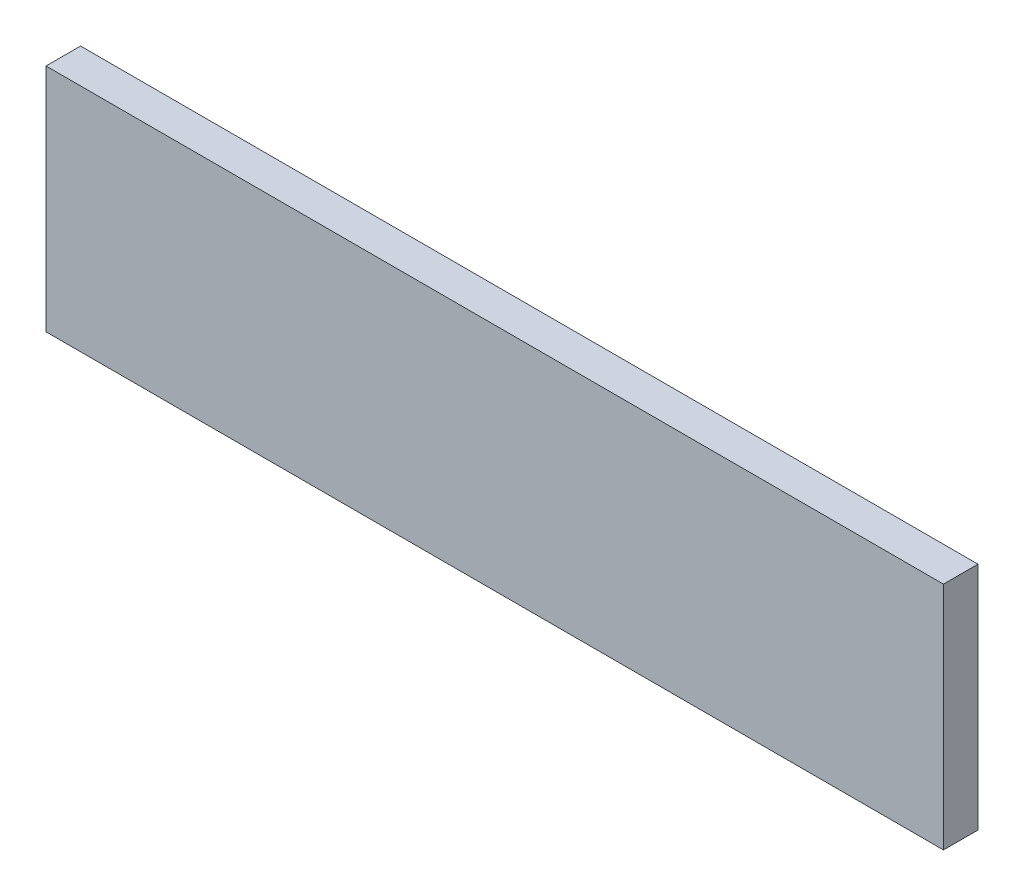
ISO-10303-21;
HEADER;
FILE_DESCRIPTION(('STEP AP214'),'2;1');
FILE_NAME('part.step','',(''),(''),'','','');
FILE_SCHEMA(('AUTOMOTIVE_DESIGN { 1 0 10303 214 1 1 1 1 }'));
ENDSEC;
DATA;
#1=APPLICATION_CONTEXT('core data for automotive mechanical design processes');
#2=APPLICATION_PROTOCOL_DEFINITION('international standard','automotive_design',2000,#1);
#3=PRODUCT_CONTEXT('',#1,'mechanical');
#4=PRODUCT('Part','Part','',(#3));
#5=PRODUCT_RELATED_PRODUCT_CATEGORY('part','',(#4));
#6=PRODUCT_DEFINITION_FORMATION('','',#4);
#7=PRODUCT_DEFINITION_CONTEXT('part definition',#1,'design');
#8=PRODUCT_DEFINITION('design','',#6,#7);
#9=PRODUCT_DEFINITION_SHAPE('','',#8);
#10=(LENGTH_UNIT() NAMED_UNIT(*) SI_UNIT(.MILLI.,.METRE.));
#11=(NAMED_UNIT(*) PLANE_ANGLE_UNIT() SI_UNIT($,.RADIAN.));
#12=(NAMED_UNIT(*) SI_UNIT($,.STERADIAN.) SOLID_ANGLE_UNIT());
#13=UNCERTAINTY_MEASURE_WITH_UNIT(LENGTH_MEASURE(1.E-05),#10,'distance_accuracy_value','');
#14=(GEOMETRIC_REPRESENTATION_CONTEXT(3) GLOBAL_UNCERTAINTY_ASSIGNED_CONTEXT((#13)) GLOBAL_UNIT_ASSIGNED_CONTEXT((#10,
#11,#12)) REPRESENTATION_CONTEXT('',''));
#15=CARTESIAN_POINT('',(0.,0.,0.));
#16=DIRECTION('',(0.,0.,1.));
#17=DIRECTION('',(1.,0.,0.));
#18=AXIS2_PLACEMENT_3D('',#15,#16,#17);
#19=CARTESIAN_POINT('',(-157.326601488341,5411.8315292923,19.05));
#20=DIRECTION('',(1.,0.,0.));
#21=DIRECTION('',(0.,0.,-1.));
#22=AXIS2_PLACEMENT_3D('',#19,#20,#21);
#23=PLANE('',#22);
#24=DIRECTION('',(0.,-1.,0.));
#25=VECTOR('',#24,1.);
#26=CARTESIAN_POINT('',(-157.326601488341,5411.8315292923,0.));
#27=LINE('',#26,#25);
#28=CARTESIAN_POINT('',(-157.326601488341,5411.8315292923,0.));
#29=VERTEX_POINT('',#28);
#30=CARTESIAN_POINT('',(-157.326601488341,5284.8315292923,0.));
#31=VERTEX_POINT('',#30);
#32=EDGE_CURVE('E96',#29,#31,#27,.T.);
#33=ORIENTED_EDGE('',*,*,#32,.T.);
#34=DIRECTION('',(0.,0.,-1.));
#35=VECTOR('',#34,1.);
#36=CARTESIAN_POINT('',(-157.326601488341,5284.8315292923,19.05));
#37=LINE('',#36,#35);
#38=CARTESIAN_POINT('',(-157.326601488341,5284.8315292923,19.05));
#39=VERTEX_POINT('',#38);
#40=EDGE_CURVE('E11',#39,#31,#37,.T.);
#41=ORIENTED_EDGE('',*,*,#40,.F.);
#42=DIRECTION('',(0.,-1.,0.));
#43=VECTOR('',#42,1.);
#44=CARTESIAN_POINT('',(-157.326601488341,5411.8315292923,19.05));
#45=LINE('',#44,#43);
#46=CARTESIAN_POINT('',(-157.326601488341,5411.8315292923,19.05));
#47=VERTEX_POINT('',#46);
#48=EDGE_CURVE('E84',#47,#39,#45,.T.);
#49=ORIENTED_EDGE('',*,*,#48,.F.);
#50=DIRECTION('',(0.,0.,-1.));
#51=VECTOR('',#50,1.);
#52=CARTESIAN_POINT('',(-157.326601488341,5411.8315292923,19.05));
#53=LINE('',#52,#51);
#54=EDGE_CURVE('E92',#47,#29,#53,.T.);
#55=ORIENTED_EDGE('',*,*,#54,.T.);
#56=EDGE_LOOP('',(#33,#41,#49,#55));
#57=FACE_BOUND('',#56,.T.);
#58=ADVANCED_FACE('F33',(#57),#23,.F.);
#59=CARTESIAN_POINT('',(-157.326601488341,5284.8315292923,19.05));
#60=DIRECTION('',(0.,1.,0.));
#61=DIRECTION('',(0.,0.,1.));
#62=AXIS2_PLACEMENT_3D('',#59,#60,#61);
#63=PLANE('',#62);
#64=DIRECTION('',(1.,0.,0.));
#65=VECTOR('',#64,1.);
#66=CARTESIAN_POINT('',(-157.326601488341,5284.8315292923,0.));
#67=LINE('',#66,#65);
#68=CARTESIAN_POINT('',(337.719398511659,5284.8315292923,0.));
#69=VERTEX_POINT('',#68);
#70=EDGE_CURVE('E88',#31,#69,#67,.T.);
#71=ORIENTED_EDGE('',*,*,#70,.T.);
#72=DIRECTION('',(0.,0.,-1.));
#73=VECTOR('',#72,1.);
#74=CARTESIAN_POINT('',(337.719398511659,5284.8315292923,19.05));
#75=LINE('',#74,#73);
#76=CARTESIAN_POINT('',(337.719398511659,5284.8315292923,19.05));
#77=VERTEX_POINT('',#76);
#78=EDGE_CURVE('E41',#77,#69,#75,.T.);
#79=ORIENTED_EDGE('',*,*,#78,.F.);
#80=DIRECTION('',(1.,0.,0.));
#81=VECTOR('',#80,1.);
#82=CARTESIAN_POINT('',(-157.326601488341,5284.8315292923,19.05));
#83=LINE('',#82,#81);
#84=EDGE_CURVE('E79',#39,#77,#83,.T.);
#85=ORIENTED_EDGE('',*,*,#84,.F.);
#86=ORIENTED_EDGE('',*,*,#40,.T.);
#87=EDGE_LOOP('',(#71,#79,#85,#86));
#88=FACE_BOUND('',#87,.T.);
#89=ADVANCED_FACE('F87',(#88),#63,.F.);
#90=CARTESIAN_POINT('',(337.719398511659,5411.8315292923,19.05));
#91=DIRECTION('',(-1.,0.,0.));
#92=DIRECTION('',(0.,0.,1.));
#93=AXIS2_PLACEMENT_3D('',#90,#91,#92);
#94=PLANE('',#93);
#95=DIRECTION('',(0.,1.,0.));
#96=VECTOR('',#95,1.);
#97=CARTESIAN_POINT('',(337.719398511659,5411.8315292923,0.));
#98=LINE('',#97,#96);
#99=CARTESIAN_POINT('',(337.719398511659,5411.8315292923,0.));
#100=VERTEX_POINT('',#99);
#101=EDGE_CURVE('E66',#69,#100,#98,.T.);
#102=ORIENTED_EDGE('',*,*,#101,.T.);
#103=DIRECTION('',(0.,0.,-1.));
#104=VECTOR('',#103,1.);
#105=CARTESIAN_POINT('',(337.719398511659,5411.8315292923,19.05));
#106=LINE('',#105,#104);
#107=CARTESIAN_POINT('',(337.719398511659,5411.8315292923,19.05));
#108=VERTEX_POINT('',#107);
#109=EDGE_CURVE('E89',#108,#100,#106,.T.);
#110=ORIENTED_EDGE('',*,*,#109,.F.);
#111=DIRECTION('',(0.,1.,0.));
#112=VECTOR('',#111,1.);
#113=CARTESIAN_POINT('',(337.719398511659,5411.8315292923,19.05));
#114=LINE('',#113,#112);
#115=EDGE_CURVE('E82',#77,#108,#114,.T.);
#116=ORIENTED_EDGE('',*,*,#115,.F.);
#117=ORIENTED_EDGE('',*,*,#78,.T.);
#118=EDGE_LOOP('',(#102,#110,#116,#117));
#119=FACE_BOUND('',#118,.T.);
#120=ADVANCED_FACE('F90',(#119),#94,.F.);
#121=CARTESIAN_POINT('',(-157.326601488341,5411.8315292923,19.05));
#122=DIRECTION('',(0.,-1.,0.));
#123=DIRECTION('',(0.,0.,-1.));
#124=AXIS2_PLACEMENT_3D('',#121,#122,#123);
#125=PLANE('',#124);
#126=DIRECTION('',(-1.,0.,0.));
#127=VECTOR('',#126,1.);
#128=CARTESIAN_POINT('',(-157.326601488341,5411.8315292923,0.));
#129=LINE('',#128,#127);
#130=EDGE_CURVE('E72',#100,#29,#129,.T.);
#131=ORIENTED_EDGE('',*,*,#130,.T.);
#132=ORIENTED_EDGE('',*,*,#54,.F.);
#133=DIRECTION('',(-1.,0.,0.));
#134=VECTOR('',#133,1.);
#135=CARTESIAN_POINT('',(-157.326601488341,5411.8315292923,19.05));
#136=LINE('',#135,#134);
#137=EDGE_CURVE('E49',#108,#47,#136,.T.);
#138=ORIENTED_EDGE('',*,*,#137,.F.);
#139=ORIENTED_EDGE('',*,*,#109,.T.);
#140=EDGE_LOOP('',(#131,#132,#138,#139));
#141=FACE_BOUND('',#140,.T.);
#142=ADVANCED_FACE('F103',(#141),#125,.F.);
#143=CARTESIAN_POINT('',(0.,0.,19.05));
#144=DIRECTION('',(0.,0.,1.));
#145=DIRECTION('',(1.,0.,0.));
#146=AXIS2_PLACEMENT_3D('',#143,#144,#145);
#147=PLANE('',#146);
#148=ORIENTED_EDGE('',*,*,#48,.T.);
#149=ORIENTED_EDGE('',*,*,#84,.T.);
#150=ORIENTED_EDGE('',*,*,#115,.T.);
#151=ORIENTED_EDGE('',*,*,#137,.T.);
#152=EDGE_LOOP('',(#148,#149,#150,#151));
#153=FACE_BOUND('',#152,.T.);
#154=ADVANCED_FACE('F80',(#153),#147,.T.);
#155=CARTESIAN_POINT('',(0.,0.,0.));
#156=DIRECTION('',(0.,0.,1.));
#157=DIRECTION('',(1.,0.,0.));
#158=AXIS2_PLACEMENT_3D('',#155,#156,#157);
#159=PLANE('',#158);
#160=ORIENTED_EDGE('',*,*,#32,.F.);
#161=ORIENTED_EDGE('',*,*,#130,.F.);
#162=ORIENTED_EDGE('',*,*,#101,.F.);
#163=ORIENTED_EDGE('',*,*,#70,.F.);
#164=EDGE_LOOP('',(#160,#161,#162,#163));
#165=FACE_BOUND('',#164,.T.);
#166=ADVANCED_FACE('F106',(#165),#159,.F.);
#167=CLOSED_SHELL('',(#58,#89,#120,#142,#154,#166));
#168=MANIFOLD_SOLID_BREP('B2',#167);
#169=ADVANCED_BREP_SHAPE_REPRESENTATION('',(#18,#168),#14);
#170=SHAPE_DEFINITION_REPRESENTATION(#9,#169);
ENDSEC;
END-ISO-10303-21;
